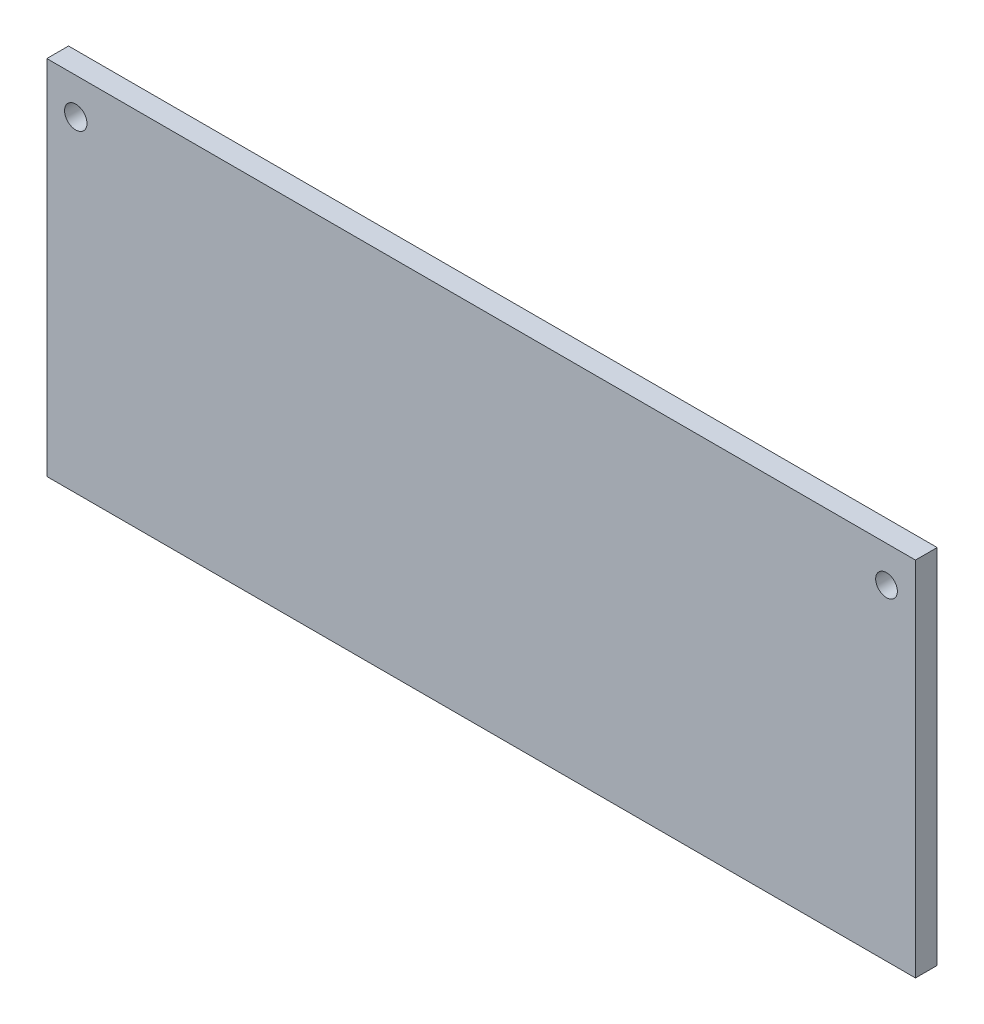
ISO-10303-21;
HEADER;
FILE_DESCRIPTION(('STEP AP214'),'2;1');
FILE_NAME('part.step','',(''),(''),'','','');
FILE_SCHEMA(('AUTOMOTIVE_DESIGN { 1 0 10303 214 1 1 1 1 }'));
ENDSEC;
DATA;
#1=APPLICATION_CONTEXT('core data for automotive mechanical design processes');
#2=APPLICATION_PROTOCOL_DEFINITION('international standard','automotive_design',2000,#1);
#3=PRODUCT_CONTEXT('',#1,'mechanical');
#4=PRODUCT('Part','Part','',(#3));
#5=PRODUCT_RELATED_PRODUCT_CATEGORY('part','',(#4));
#6=PRODUCT_DEFINITION_FORMATION('','',#4);
#7=PRODUCT_DEFINITION_CONTEXT('part definition',#1,'design');
#8=PRODUCT_DEFINITION('design','',#6,#7);
#9=PRODUCT_DEFINITION_SHAPE('','',#8);
#10=(LENGTH_UNIT() NAMED_UNIT(*) SI_UNIT(.MILLI.,.METRE.));
#11=(NAMED_UNIT(*) PLANE_ANGLE_UNIT() SI_UNIT($,.RADIAN.));
#12=(NAMED_UNIT(*) SI_UNIT($,.STERADIAN.) SOLID_ANGLE_UNIT());
#13=UNCERTAINTY_MEASURE_WITH_UNIT(LENGTH_MEASURE(1.E-05),#10,'distance_accuracy_value','');
#14=(GEOMETRIC_REPRESENTATION_CONTEXT(3) GLOBAL_UNCERTAINTY_ASSIGNED_CONTEXT((#13)) GLOBAL_UNIT_ASSIGNED_CONTEXT((#10,
#11,#12)) REPRESENTATION_CONTEXT('',''));
#15=CARTESIAN_POINT('',(0.,0.,0.));
#16=DIRECTION('',(0.,0.,1.));
#17=DIRECTION('',(1.,0.,0.));
#18=AXIS2_PLACEMENT_3D('',#15,#16,#17);
#19=CARTESIAN_POINT('',(-60.,-25.,3.));
#20=DIRECTION('',(1.,0.,0.));
#21=DIRECTION('',(0.,0.,-1.));
#22=AXIS2_PLACEMENT_3D('',#19,#20,#21);
#23=PLANE('',#22);
#24=DIRECTION('',(0.,-1.,0.));
#25=VECTOR('',#24,1.);
#26=CARTESIAN_POINT('',(-60.,-25.,0.));
#27=LINE('',#26,#25);
#28=CARTESIAN_POINT('',(-60.,25.,0.));
#29=VERTEX_POINT('',#28);
#30=CARTESIAN_POINT('',(-60.,-25.,0.));
#31=VERTEX_POINT('',#30);
#32=EDGE_CURVE('E111',#29,#31,#27,.T.);
#33=ORIENTED_EDGE('',*,*,#32,.T.);
#34=DIRECTION('',(0.,0.,-1.));
#35=VECTOR('',#34,1.);
#36=CARTESIAN_POINT('',(-60.,-25.,3.));
#37=LINE('',#36,#35);
#38=CARTESIAN_POINT('',(-60.,-25.,3.));
#39=VERTEX_POINT('',#38);
#40=EDGE_CURVE('E11',#39,#31,#37,.T.);
#41=ORIENTED_EDGE('',*,*,#40,.F.);
#42=DIRECTION('',(0.,-1.,0.));
#43=VECTOR('',#42,1.);
#44=CARTESIAN_POINT('',(-60.,-25.,3.));
#45=LINE('',#44,#43);
#46=CARTESIAN_POINT('',(-60.,25.,3.));
#47=VERTEX_POINT('',#46);
#48=EDGE_CURVE('E95',#47,#39,#45,.T.);
#49=ORIENTED_EDGE('',*,*,#48,.F.);
#50=DIRECTION('',(0.,0.,-1.));
#51=VECTOR('',#50,1.);
#52=CARTESIAN_POINT('',(-60.,25.,3.));
#53=LINE('',#52,#51);
#54=EDGE_CURVE('E107',#47,#29,#53,.T.);
#55=ORIENTED_EDGE('',*,*,#54,.T.);
#56=EDGE_LOOP('',(#33,#41,#49,#55));
#57=FACE_BOUND('',#56,.T.);
#58=ADVANCED_FACE('F43',(#57),#23,.F.);
#59=CARTESIAN_POINT('',(60.,-25.,3.));
#60=DIRECTION('',(0.,1.,0.));
#61=DIRECTION('',(-1.,0.,0.));
#62=AXIS2_PLACEMENT_3D('',#59,#60,#61);
#63=PLANE('',#62);
#64=DIRECTION('',(1.,0.,0.));
#65=VECTOR('',#64,1.);
#66=CARTESIAN_POINT('',(60.,-25.,0.));
#67=LINE('',#66,#65);
#68=CARTESIAN_POINT('',(60.,-25.,0.));
#69=VERTEX_POINT('',#68);
#70=EDGE_CURVE('E100',#31,#69,#67,.T.);
#71=ORIENTED_EDGE('',*,*,#70,.T.);
#72=DIRECTION('',(0.,0.,-1.));
#73=VECTOR('',#72,1.);
#74=CARTESIAN_POINT('',(60.,-25.,3.));
#75=LINE('',#74,#73);
#76=CARTESIAN_POINT('',(60.,-25.,3.));
#77=VERTEX_POINT('',#76);
#78=EDGE_CURVE('E52',#77,#69,#75,.T.);
#79=ORIENTED_EDGE('',*,*,#78,.F.);
#80=DIRECTION('',(1.,0.,0.));
#81=VECTOR('',#80,1.);
#82=CARTESIAN_POINT('',(60.,-25.,3.));
#83=LINE('',#82,#81);
#84=EDGE_CURVE('E90',#39,#77,#83,.T.);
#85=ORIENTED_EDGE('',*,*,#84,.F.);
#86=ORIENTED_EDGE('',*,*,#40,.T.);
#87=EDGE_LOOP('',(#71,#79,#85,#86));
#88=FACE_BOUND('',#87,.T.);
#89=ADVANCED_FACE('F99',(#88),#63,.F.);
#90=CARTESIAN_POINT('',(60.,-25.,3.));
#91=DIRECTION('',(-1.,0.,0.));
#92=DIRECTION('',(0.,-1.,0.));
#93=AXIS2_PLACEMENT_3D('',#90,#91,#92);
#94=PLANE('',#93);
#95=DIRECTION('',(0.,1.,0.));
#96=VECTOR('',#95,1.);
#97=CARTESIAN_POINT('',(60.,-25.,0.));
#98=LINE('',#97,#96);
#99=CARTESIAN_POINT('',(60.,25.,0.));
#100=VERTEX_POINT('',#99);
#101=EDGE_CURVE('E77',#69,#100,#98,.T.);
#102=ORIENTED_EDGE('',*,*,#101,.T.);
#103=DIRECTION('',(0.,0.,-1.));
#104=VECTOR('',#103,1.);
#105=CARTESIAN_POINT('',(60.,25.,3.));
#106=LINE('',#105,#104);
#107=CARTESIAN_POINT('',(60.,25.,3.));
#108=VERTEX_POINT('',#107);
#109=EDGE_CURVE('E102',#108,#100,#106,.T.);
#110=ORIENTED_EDGE('',*,*,#109,.F.);
#111=DIRECTION('',(0.,1.,0.));
#112=VECTOR('',#111,1.);
#113=CARTESIAN_POINT('',(60.,-25.,3.));
#114=LINE('',#113,#112);
#115=EDGE_CURVE('E93',#77,#108,#114,.T.);
#116=ORIENTED_EDGE('',*,*,#115,.F.);
#117=ORIENTED_EDGE('',*,*,#78,.T.);
#118=EDGE_LOOP('',(#102,#110,#116,#117));
#119=FACE_BOUND('',#118,.T.);
#120=ADVANCED_FACE('F103',(#119),#94,.F.);
#121=CARTESIAN_POINT('',(60.,25.,3.));
#122=DIRECTION('',(0.,-1.,0.));
#123=DIRECTION('',(1.,0.,0.));
#124=AXIS2_PLACEMENT_3D('',#121,#122,#123);
#125=PLANE('',#124);
#126=DIRECTION('',(-1.,0.,0.));
#127=VECTOR('',#126,1.);
#128=CARTESIAN_POINT('',(60.,25.,0.));
#129=LINE('',#128,#127);
#130=EDGE_CURVE('E83',#100,#29,#129,.T.);
#131=ORIENTED_EDGE('',*,*,#130,.T.);
#132=ORIENTED_EDGE('',*,*,#54,.F.);
#133=DIRECTION('',(-1.,0.,0.));
#134=VECTOR('',#133,1.);
#135=CARTESIAN_POINT('',(60.,25.,3.));
#136=LINE('',#135,#134);
#137=EDGE_CURVE('E60',#108,#47,#136,.T.);
#138=ORIENTED_EDGE('',*,*,#137,.F.);
#139=ORIENTED_EDGE('',*,*,#109,.T.);
#140=EDGE_LOOP('',(#131,#132,#138,#139));
#141=FACE_BOUND('',#140,.T.);
#142=ADVANCED_FACE('F125',(#141),#125,.F.);
#143=CARTESIAN_POINT('',(0.,0.,3.));
#144=DIRECTION('',(0.,0.,1.));
#145=DIRECTION('',(1.,0.,0.));
#146=AXIS2_PLACEMENT_3D('',#143,#144,#145);
#147=PLANE('',#146);
#148=CARTESIAN_POINT('',(56.,20.,3.));
#149=DIRECTION('',(0.,0.,1.));
#150=DIRECTION('',(1.,0.,0.));
#151=AXIS2_PLACEMENT_3D('',#148,#149,#150);
#152=CIRCLE('',#151,1.5);
#153=CARTESIAN_POINT('',(57.5,20.,3.));
#154=VERTEX_POINT('',#153);
#155=EDGE_CURVE('E115',#154,#154,#152,.T.);
#156=ORIENTED_EDGE('',*,*,#155,.F.);
#157=EDGE_LOOP('',(#156));
#158=FACE_BOUND('',#157,.T.);
#159=CARTESIAN_POINT('',(-56.,20.,3.));
#160=DIRECTION('',(0.,0.,1.));
#161=DIRECTION('',(1.,0.,0.));
#162=AXIS2_PLACEMENT_3D('',#159,#160,#161);
#163=CIRCLE('',#162,1.54999999999999);
#164=CARTESIAN_POINT('',(-54.45,20.,3.));
#165=VERTEX_POINT('',#164);
#166=EDGE_CURVE('E135',#165,#165,#163,.T.);
#167=ORIENTED_EDGE('',*,*,#166,.F.);
#168=EDGE_LOOP('',(#167));
#169=FACE_BOUND('',#168,.T.);
#170=ORIENTED_EDGE('',*,*,#48,.T.);
#171=ORIENTED_EDGE('',*,*,#84,.T.);
#172=ORIENTED_EDGE('',*,*,#115,.T.);
#173=ORIENTED_EDGE('',*,*,#137,.T.);
#174=EDGE_LOOP('',(#170,#171,#172,#173));
#175=FACE_BOUND('',#174,.T.);
#176=ADVANCED_FACE('F91',(#158,#169,#175),#147,.T.);
#177=CARTESIAN_POINT('',(0.,0.,0.));
#178=DIRECTION('',(0.,0.,1.));
#179=DIRECTION('',(1.,0.,0.));
#180=AXIS2_PLACEMENT_3D('',#177,#178,#179);
#181=PLANE('',#180);
#182=CARTESIAN_POINT('',(56.,20.,0.));
#183=DIRECTION('',(0.,0.,-1.));
#184=DIRECTION('',(-1.,0.,0.));
#185=AXIS2_PLACEMENT_3D('',#182,#183,#184);
#186=CIRCLE('',#185,1.5);
#187=CARTESIAN_POINT('',(54.5,20.,0.));
#188=VERTEX_POINT('',#187);
#189=EDGE_CURVE('E139',#188,#188,#186,.T.);
#190=ORIENTED_EDGE('',*,*,#189,.F.);
#191=EDGE_LOOP('',(#190));
#192=FACE_BOUND('',#191,.T.);
#193=CARTESIAN_POINT('',(-56.,20.,0.));
#194=DIRECTION('',(0.,0.,-1.));
#195=DIRECTION('',(-1.,0.,0.));
#196=AXIS2_PLACEMENT_3D('',#193,#194,#195);
#197=CIRCLE('',#196,1.54999999999999);
#198=CARTESIAN_POINT('',(-57.55,20.,0.));
#199=VERTEX_POINT('',#198);
#200=EDGE_CURVE('E140',#199,#199,#197,.T.);
#201=ORIENTED_EDGE('',*,*,#200,.F.);
#202=EDGE_LOOP('',(#201));
#203=FACE_BOUND('',#202,.T.);
#204=ORIENTED_EDGE('',*,*,#32,.F.);
#205=ORIENTED_EDGE('',*,*,#130,.F.);
#206=ORIENTED_EDGE('',*,*,#101,.F.);
#207=ORIENTED_EDGE('',*,*,#70,.F.);
#208=EDGE_LOOP('',(#204,#205,#206,#207));
#209=FACE_BOUND('',#208,.T.);
#210=ADVANCED_FACE('F128',(#192,#203,#209),#181,.F.);
#211=CARTESIAN_POINT('',(-56.,20.,10.));
#212=DIRECTION('',(0.,0.,-1.));
#213=DIRECTION('',(-1.,0.,0.));
#214=AXIS2_PLACEMENT_3D('',#211,#212,#213);
#215=CYLINDRICAL_SURFACE('',#214,1.54999999999999);
#216=ORIENTED_EDGE('',*,*,#166,.T.);
#217=EDGE_LOOP('',(#216));
#218=FACE_BOUND('',#217,.T.);
#219=ORIENTED_EDGE('',*,*,#200,.T.);
#220=EDGE_LOOP('',(#219));
#221=FACE_BOUND('',#220,.T.);
#222=ADVANCED_FACE('F152',(#218,#221),#215,.F.);
#223=CARTESIAN_POINT('',(56.,20.,10.));
#224=DIRECTION('',(0.,0.,-1.));
#225=DIRECTION('',(-1.,0.,0.));
#226=AXIS2_PLACEMENT_3D('',#223,#224,#225);
#227=CYLINDRICAL_SURFACE('',#226,1.5);
#228=ORIENTED_EDGE('',*,*,#155,.T.);
#229=EDGE_LOOP('',(#228));
#230=FACE_BOUND('',#229,.T.);
#231=ORIENTED_EDGE('',*,*,#189,.T.);
#232=EDGE_LOOP('',(#231));
#233=FACE_BOUND('',#232,.T.);
#234=ADVANCED_FACE('F148',(#230,#233),#227,.F.);
#235=CLOSED_SHELL('',(#58,#89,#120,#142,#176,#210,#222,#234));
#236=MANIFOLD_SOLID_BREP('B2',#235);
#237=ADVANCED_BREP_SHAPE_REPRESENTATION('',(#18,#236),#14);
#238=SHAPE_DEFINITION_REPRESENTATION(#9,#237);
ENDSEC;
END-ISO-10303-21;
